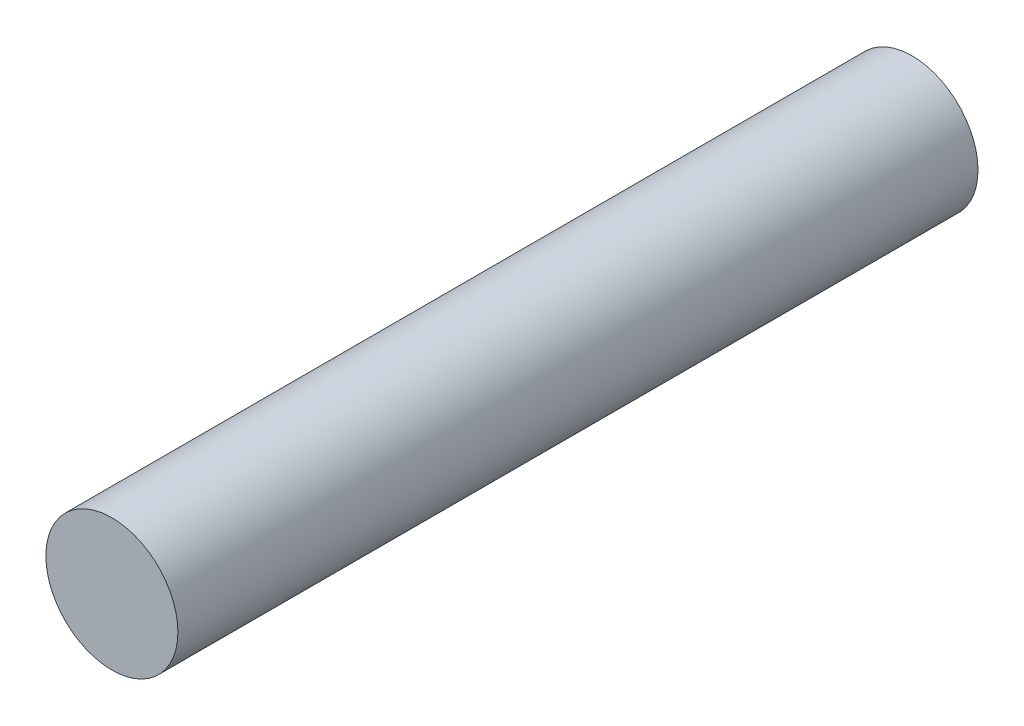
ISO-10303-21;
HEADER;
FILE_DESCRIPTION(('STEP AP214'),'2;1');
FILE_NAME('part.step','',(''),(''),'','','');
FILE_SCHEMA(('AUTOMOTIVE_DESIGN { 1 0 10303 214 1 1 1 1 }'));
ENDSEC;
DATA;
#1=APPLICATION_CONTEXT('core data for automotive mechanical design processes');
#2=APPLICATION_PROTOCOL_DEFINITION('international standard','automotive_design',2000,#1);
#3=PRODUCT_CONTEXT('',#1,'mechanical');
#4=PRODUCT('Part','Part','',(#3));
#5=PRODUCT_RELATED_PRODUCT_CATEGORY('part','',(#4));
#6=PRODUCT_DEFINITION_FORMATION('','',#4);
#7=PRODUCT_DEFINITION_CONTEXT('part definition',#1,'design');
#8=PRODUCT_DEFINITION('design','',#6,#7);
#9=PRODUCT_DEFINITION_SHAPE('','',#8);
#10=(LENGTH_UNIT() NAMED_UNIT(*) SI_UNIT(.MILLI.,.METRE.));
#11=(NAMED_UNIT(*) PLANE_ANGLE_UNIT() SI_UNIT($,.RADIAN.));
#12=(NAMED_UNIT(*) SI_UNIT($,.STERADIAN.) SOLID_ANGLE_UNIT());
#13=UNCERTAINTY_MEASURE_WITH_UNIT(LENGTH_MEASURE(1.E-05),#10,'distance_accuracy_value','');
#14=(GEOMETRIC_REPRESENTATION_CONTEXT(3) GLOBAL_UNCERTAINTY_ASSIGNED_CONTEXT((#13)) GLOBAL_UNIT_ASSIGNED_CONTEXT((#10,
#11,#12)) REPRESENTATION_CONTEXT('',''));
#15=CARTESIAN_POINT('',(0.,0.,0.));
#16=DIRECTION('',(0.,0.,1.));
#17=DIRECTION('',(1.,0.,0.));
#18=AXIS2_PLACEMENT_3D('',#15,#16,#17);
#19=CARTESIAN_POINT('',(0.,0.,18.));
#20=DIRECTION('',(0.,0.,-1.));
#21=DIRECTION('',(-1.,0.,0.));
#22=AXIS2_PLACEMENT_3D('',#19,#20,#21);
#23=CYLINDRICAL_SURFACE('',#22,1.485);
#24=CARTESIAN_POINT('',(0.,0.,18.));
#25=DIRECTION('',(0.,0.,1.));
#26=DIRECTION('',(1.,0.,0.));
#27=AXIS2_PLACEMENT_3D('',#24,#25,#26);
#28=CIRCLE('',#27,1.485);
#29=CARTESIAN_POINT('',(1.485,0.,18.));
#30=VERTEX_POINT('',#29);
#31=EDGE_CURVE('E10',#30,#30,#28,.T.);
#32=ORIENTED_EDGE('',*,*,#31,.F.);
#33=EDGE_LOOP('',(#32));
#34=FACE_BOUND('',#33,.T.);
#35=CARTESIAN_POINT('',(0.,0.,0.));
#36=DIRECTION('',(0.,0.,1.));
#37=DIRECTION('',(1.,0.,0.));
#38=AXIS2_PLACEMENT_3D('',#35,#36,#37);
#39=CIRCLE('',#38,1.485);
#40=CARTESIAN_POINT('',(1.485,0.,0.));
#41=VERTEX_POINT('',#40);
#42=EDGE_CURVE('E36',#41,#41,#39,.T.);
#43=ORIENTED_EDGE('',*,*,#42,.T.);
#44=EDGE_LOOP('',(#43));
#45=FACE_BOUND('',#44,.T.);
#46=ADVANCED_FACE('F33',(#34,#45),#23,.T.);
#47=CARTESIAN_POINT('',(0.,0.,18.));
#48=DIRECTION('',(0.,0.,1.));
#49=DIRECTION('',(1.,0.,0.));
#50=AXIS2_PLACEMENT_3D('',#47,#48,#49);
#51=PLANE('',#50);
#52=ORIENTED_EDGE('',*,*,#31,.T.);
#53=EDGE_LOOP('',(#52));
#54=FACE_BOUND('',#53,.T.);
#55=ADVANCED_FACE('F48',(#54),#51,.T.);
#56=CARTESIAN_POINT('',(0.,0.,0.));
#57=DIRECTION('',(0.,0.,1.));
#58=DIRECTION('',(1.,0.,0.));
#59=AXIS2_PLACEMENT_3D('',#56,#57,#58);
#60=PLANE('',#59);
#61=ORIENTED_EDGE('',*,*,#42,.F.);
#62=EDGE_LOOP('',(#61));
#63=FACE_BOUND('',#62,.T.);
#64=ADVANCED_FACE('F46',(#63),#60,.F.);
#65=CLOSED_SHELL('',(#46,#55,#64));
#66=MANIFOLD_SOLID_BREP('B2',#65);
#67=ADVANCED_BREP_SHAPE_REPRESENTATION('',(#18,#66),#14);
#68=SHAPE_DEFINITION_REPRESENTATION(#9,#67);
ENDSEC;
END-ISO-10303-21;
